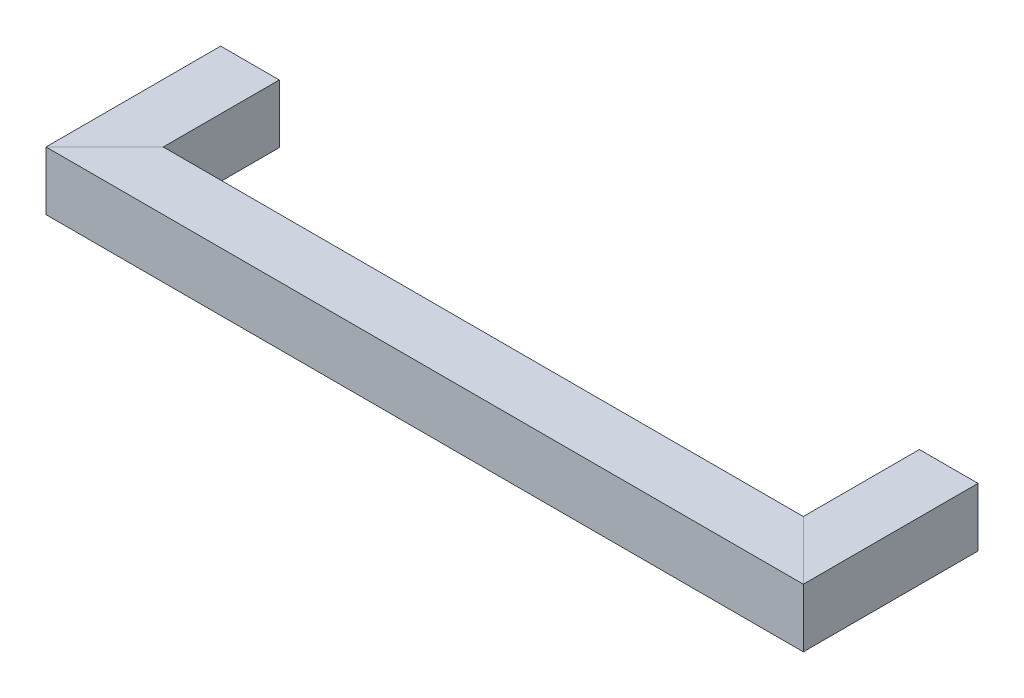
ISO-10303-21;
HEADER;
FILE_DESCRIPTION(('STEP AP214'),'2;1');
FILE_NAME('part.step','',(''),(''),'','','');
FILE_SCHEMA(('AUTOMOTIVE_DESIGN { 1 0 10303 214 1 1 1 1 }'));
ENDSEC;
DATA;
#1=APPLICATION_CONTEXT('core data for automotive mechanical design processes');
#2=APPLICATION_PROTOCOL_DEFINITION('international standard','automotive_design',2000,#1);
#3=PRODUCT_CONTEXT('',#1,'mechanical');
#4=PRODUCT('Part','Part','',(#3));
#5=PRODUCT_RELATED_PRODUCT_CATEGORY('part','',(#4));
#6=PRODUCT_DEFINITION_FORMATION('','',#4);
#7=PRODUCT_DEFINITION_CONTEXT('part definition',#1,'design');
#8=PRODUCT_DEFINITION('design','',#6,#7);
#9=PRODUCT_DEFINITION_SHAPE('','',#8);
#10=(LENGTH_UNIT() NAMED_UNIT(*) SI_UNIT(.MILLI.,.METRE.));
#11=(NAMED_UNIT(*) PLANE_ANGLE_UNIT() SI_UNIT($,.RADIAN.));
#12=(NAMED_UNIT(*) SI_UNIT($,.STERADIAN.) SOLID_ANGLE_UNIT());
#13=UNCERTAINTY_MEASURE_WITH_UNIT(LENGTH_MEASURE(1.E-05),#10,'distance_accuracy_value','');
#14=(GEOMETRIC_REPRESENTATION_CONTEXT(3) GLOBAL_UNCERTAINTY_ASSIGNED_CONTEXT((#13)) GLOBAL_UNIT_ASSIGNED_CONTEXT((#10,
#11,#12)) REPRESENTATION_CONTEXT('',''));
#15=CARTESIAN_POINT('',(0.,0.,0.));
#16=DIRECTION('',(0.,0.,1.));
#17=DIRECTION('',(1.,0.,0.));
#18=AXIS2_PLACEMENT_3D('',#15,#16,#17);
#19=CARTESIAN_POINT('',(298.,0.,0.));
#20=DIRECTION('',(0.,0.,-1.));
#21=DIRECTION('',(-1.,0.,0.));
#22=AXIS2_PLACEMENT_3D('',#19,#20,#21);
#23=PLANE('',#22);
#24=DIRECTION('',(0.,-1.,0.));
#25=VECTOR('',#24,1.);
#26=CARTESIAN_POINT('',(310.5,-12.5,0.));
#27=LINE('',#26,#25);
#28=CARTESIAN_POINT('',(310.5,12.5,0.));
#29=VERTEX_POINT('',#28);
#30=CARTESIAN_POINT('',(310.5,-12.5,0.));
#31=VERTEX_POINT('',#30);
#32=EDGE_CURVE('E84',#29,#31,#27,.T.);
#33=ORIENTED_EDGE('',*,*,#32,.T.);
#34=DIRECTION('',(-1.,0.,0.));
#35=VECTOR('',#34,1.);
#36=CARTESIAN_POINT('',(285.5,-12.5,0.));
#37=LINE('',#36,#35);
#38=CARTESIAN_POINT('',(285.5,-12.5,0.));
#39=VERTEX_POINT('',#38);
#40=EDGE_CURVE('E82',#31,#39,#37,.T.);
#41=ORIENTED_EDGE('',*,*,#40,.T.);
#42=DIRECTION('',(0.,1.,0.));
#43=VECTOR('',#42,1.);
#44=CARTESIAN_POINT('',(285.5,-12.5,0.));
#45=LINE('',#44,#43);
#46=CARTESIAN_POINT('',(285.5,12.5,0.));
#47=VERTEX_POINT('',#46);
#48=EDGE_CURVE('E79',#39,#47,#45,.T.);
#49=ORIENTED_EDGE('',*,*,#48,.T.);
#50=DIRECTION('',(1.,0.,0.));
#51=VECTOR('',#50,1.);
#52=CARTESIAN_POINT('',(285.5,12.5,0.));
#53=LINE('',#52,#51);
#54=EDGE_CURVE('E98',#47,#29,#53,.T.);
#55=ORIENTED_EDGE('',*,*,#54,.T.);
#56=EDGE_LOOP('',(#33,#41,#49,#55));
#57=FACE_BOUND('',#56,.T.);
#58=ADVANCED_FACE('F33',(#57),#23,.T.);
#59=CARTESIAN_POINT('',(0.,0.,0.));
#60=DIRECTION('',(0.,0.,1.));
#61=DIRECTION('',(1.,0.,0.));
#62=AXIS2_PLACEMENT_3D('',#59,#60,#61);
#63=PLANE('',#62);
#64=DIRECTION('',(0.,-1.,0.));
#65=VECTOR('',#64,1.);
#66=CARTESIAN_POINT('',(-12.5,-12.5,0.));
#67=LINE('',#66,#65);
#68=CARTESIAN_POINT('',(-12.5,12.5,0.));
#69=VERTEX_POINT('',#68);
#70=CARTESIAN_POINT('',(-12.5,-12.5,0.));
#71=VERTEX_POINT('',#70);
#72=EDGE_CURVE('E140',#69,#71,#67,.T.);
#73=ORIENTED_EDGE('',*,*,#72,.F.);
#74=DIRECTION('',(-1.,0.,0.));
#75=VECTOR('',#74,1.);
#76=CARTESIAN_POINT('',(12.5,12.5,0.));
#77=LINE('',#76,#75);
#78=CARTESIAN_POINT('',(12.5,12.5,0.));
#79=VERTEX_POINT('',#78);
#80=EDGE_CURVE('E146',#79,#69,#77,.T.);
#81=ORIENTED_EDGE('',*,*,#80,.F.);
#82=DIRECTION('',(0.,1.,0.));
#83=VECTOR('',#82,1.);
#84=CARTESIAN_POINT('',(12.5,-12.5,0.));
#85=LINE('',#84,#83);
#86=CARTESIAN_POINT('',(12.5,-12.5,0.));
#87=VERTEX_POINT('',#86);
#88=EDGE_CURVE('E130',#87,#79,#85,.T.);
#89=ORIENTED_EDGE('',*,*,#88,.F.);
#90=DIRECTION('',(1.,0.,0.));
#91=VECTOR('',#90,1.);
#92=CARTESIAN_POINT('',(12.5,-12.5,0.));
#93=LINE('',#92,#91);
#94=EDGE_CURVE('E136',#71,#87,#93,.T.);
#95=ORIENTED_EDGE('',*,*,#94,.F.);
#96=EDGE_LOOP('',(#73,#81,#89,#95));
#97=FACE_BOUND('',#96,.T.);
#98=ADVANCED_FACE('F179',(#97),#63,.F.);
#99=CARTESIAN_POINT('',(285.5,-12.5,75.85));
#100=DIRECTION('',(-1.,0.,0.));
#101=DIRECTION('',(0.,0.,1.));
#102=AXIS2_PLACEMENT_3D('',#99,#100,#101);
#103=PLANE('',#102);
#104=DIRECTION('',(0.,-1.,0.));
#105=VECTOR('',#104,1.);
#106=CARTESIAN_POINT('',(285.5,-12.5,49.5));
#107=LINE('',#106,#105);
#108=CARTESIAN_POINT('',(285.5,12.5,49.5));
#109=VERTEX_POINT('',#108);
#110=CARTESIAN_POINT('',(285.5,-12.5,49.5));
#111=VERTEX_POINT('',#110);
#112=EDGE_CURVE('E114',#109,#111,#107,.T.);
#113=ORIENTED_EDGE('',*,*,#112,.F.);
#114=DIRECTION('',(0.,0.,-1.));
#115=VECTOR('',#114,1.);
#116=CARTESIAN_POINT('',(285.5,12.5,75.85));
#117=LINE('',#116,#115);
#118=EDGE_CURVE('E96',#109,#47,#117,.T.);
#119=ORIENTED_EDGE('',*,*,#118,.T.);
#120=ORIENTED_EDGE('',*,*,#48,.F.);
#121=DIRECTION('',(0.,0.,-1.));
#122=VECTOR('',#121,1.);
#123=CARTESIAN_POINT('',(285.5,-12.5,75.85));
#124=LINE('',#123,#122);
#125=EDGE_CURVE('E36',#111,#39,#124,.T.);
#126=ORIENTED_EDGE('',*,*,#125,.F.);
#127=EDGE_LOOP('',(#113,#119,#120,#126));
#128=FACE_BOUND('',#127,.T.);
#129=ADVANCED_FACE('F93',(#128),#103,.T.);
#130=CARTESIAN_POINT('',(285.5,12.5,75.85));
#131=DIRECTION('',(0.,1.,0.));
#132=DIRECTION('',(0.,0.,1.));
#133=AXIS2_PLACEMENT_3D('',#130,#131,#132);
#134=PLANE('',#133);
#135=DIRECTION('',(-0.707106781186548,0.,-0.707106781186548));
#136=VECTOR('',#135,1.);
#137=CARTESIAN_POINT('',(135.825,12.5,-100.175));
#138=LINE('',#137,#136);
#139=CARTESIAN_POINT('',(310.5,12.5,74.5));
#140=VERTEX_POINT('',#139);
#141=EDGE_CURVE('E127',#140,#109,#138,.T.);
#142=ORIENTED_EDGE('',*,*,#141,.F.);
#143=DIRECTION('',(0.,0.,-1.));
#144=VECTOR('',#143,1.);
#145=CARTESIAN_POINT('',(310.5,12.5,75.85));
#146=LINE('',#145,#144);
#147=EDGE_CURVE('E107',#140,#29,#146,.T.);
#148=ORIENTED_EDGE('',*,*,#147,.T.);
#149=ORIENTED_EDGE('',*,*,#54,.F.);
#150=ORIENTED_EDGE('',*,*,#118,.F.);
#151=EDGE_LOOP('',(#142,#148,#149,#150));
#152=FACE_BOUND('',#151,.T.);
#153=ADVANCED_FACE('F199',(#152),#134,.T.);
#154=CARTESIAN_POINT('',(310.5,-12.5,75.85));
#155=DIRECTION('',(1.,0.,0.));
#156=DIRECTION('',(0.,0.,-1.));
#157=AXIS2_PLACEMENT_3D('',#154,#155,#156);
#158=PLANE('',#157);
#159=DIRECTION('',(0.,1.,0.));
#160=VECTOR('',#159,1.);
#161=CARTESIAN_POINT('',(310.5,-12.5,74.5));
#162=LINE('',#161,#160);
#163=CARTESIAN_POINT('',(310.5,-12.5,74.5));
#164=VERTEX_POINT('',#163);
#165=EDGE_CURVE('E124',#164,#140,#162,.T.);
#166=ORIENTED_EDGE('',*,*,#165,.F.);
#167=DIRECTION('',(0.,0.,-1.));
#168=VECTOR('',#167,1.);
#169=CARTESIAN_POINT('',(310.5,-12.5,75.85));
#170=LINE('',#169,#168);
#171=EDGE_CURVE('E97',#164,#31,#170,.T.);
#172=ORIENTED_EDGE('',*,*,#171,.T.);
#173=ORIENTED_EDGE('',*,*,#32,.F.);
#174=ORIENTED_EDGE('',*,*,#147,.F.);
#175=EDGE_LOOP('',(#166,#172,#173,#174));
#176=FACE_BOUND('',#175,.T.);
#177=ADVANCED_FACE('F201',(#176),#158,.T.);
#178=CARTESIAN_POINT('',(285.5,-12.5,75.85));
#179=DIRECTION('',(0.,-1.,0.));
#180=DIRECTION('',(1.,0.,0.));
#181=AXIS2_PLACEMENT_3D('',#178,#179,#180);
#182=PLANE('',#181);
#183=DIRECTION('',(0.707106781186548,0.,0.707106781186548));
#184=VECTOR('',#183,1.);
#185=CARTESIAN_POINT('',(135.825,-12.5,-100.175));
#186=LINE('',#185,#184);
#187=EDGE_CURVE('E102',#111,#164,#186,.T.);
#188=ORIENTED_EDGE('',*,*,#187,.F.);
#189=ORIENTED_EDGE('',*,*,#125,.T.);
#190=ORIENTED_EDGE('',*,*,#40,.F.);
#191=ORIENTED_EDGE('',*,*,#171,.F.);
#192=EDGE_LOOP('',(#188,#189,#190,#191));
#193=FACE_BOUND('',#192,.T.);
#194=ADVANCED_FACE('F100',(#193),#182,.T.);
#195=CARTESIAN_POINT('',(-13.85,-12.5,49.5));
#196=DIRECTION('',(0.,-1.,0.));
#197=DIRECTION('',(0.,0.,-1.));
#198=AXIS2_PLACEMENT_3D('',#195,#196,#197);
#199=PLANE('',#198);
#200=DIRECTION('',(1.,0.,0.));
#201=VECTOR('',#200,1.);
#202=CARTESIAN_POINT('',(-13.85,-12.5,49.5));
#203=LINE('',#202,#201);
#204=CARTESIAN_POINT('',(12.5,-12.5,49.5));
#205=VERTEX_POINT('',#204);
#206=EDGE_CURVE('E116',#205,#111,#203,.T.);
#207=ORIENTED_EDGE('',*,*,#206,.T.);
#208=ORIENTED_EDGE('',*,*,#187,.T.);
#209=DIRECTION('',(1.,0.,0.));
#210=VECTOR('',#209,1.);
#211=CARTESIAN_POINT('',(-13.85,-12.5,74.5));
#212=LINE('',#211,#210);
#213=CARTESIAN_POINT('',(-12.5,-12.5,74.5));
#214=VERTEX_POINT('',#213);
#215=EDGE_CURVE('E103',#214,#164,#212,.T.);
#216=ORIENTED_EDGE('',*,*,#215,.F.);
#217=DIRECTION('',(-0.707106781186547,0.,0.707106781186548));
#218=VECTOR('',#217,1.);
#219=CARTESIAN_POINT('',(37.25,-12.5,24.75));
#220=LINE('',#219,#218);
#221=EDGE_CURVE('E134',#205,#214,#220,.T.);
#222=ORIENTED_EDGE('',*,*,#221,.F.);
#223=EDGE_LOOP('',(#207,#208,#216,#222));
#224=FACE_BOUND('',#223,.T.);
#225=ADVANCED_FACE('F203',(#224),#199,.T.);
#226=CARTESIAN_POINT('',(-13.85,-12.5,74.5));
#227=DIRECTION('',(0.,0.,1.));
#228=DIRECTION('',(1.,0.,0.));
#229=AXIS2_PLACEMENT_3D('',#226,#227,#228);
#230=PLANE('',#229);
#231=ORIENTED_EDGE('',*,*,#215,.T.);
#232=ORIENTED_EDGE('',*,*,#165,.T.);
#233=DIRECTION('',(1.,0.,0.));
#234=VECTOR('',#233,1.);
#235=CARTESIAN_POINT('',(-13.85,12.5,74.5));
#236=LINE('',#235,#234);
#237=CARTESIAN_POINT('',(-12.5,12.5,74.5));
#238=VERTEX_POINT('',#237);
#239=EDGE_CURVE('E105',#238,#140,#236,.T.);
#240=ORIENTED_EDGE('',*,*,#239,.F.);
#241=DIRECTION('',(0.,1.,0.));
#242=VECTOR('',#241,1.);
#243=CARTESIAN_POINT('',(-12.5,-12.5,74.5));
#244=LINE('',#243,#242);
#245=EDGE_CURVE('E42',#214,#238,#244,.T.);
#246=ORIENTED_EDGE('',*,*,#245,.F.);
#247=EDGE_LOOP('',(#231,#232,#240,#246));
#248=FACE_BOUND('',#247,.T.);
#249=ADVANCED_FACE('F202',(#248),#230,.T.);
#250=CARTESIAN_POINT('',(-13.85,12.5,49.5));
#251=DIRECTION('',(0.,1.,0.));
#252=DIRECTION('',(0.,0.,1.));
#253=AXIS2_PLACEMENT_3D('',#250,#251,#252);
#254=PLANE('',#253);
#255=ORIENTED_EDGE('',*,*,#239,.T.);
#256=ORIENTED_EDGE('',*,*,#141,.T.);
#257=DIRECTION('',(1.,0.,0.));
#258=VECTOR('',#257,1.);
#259=CARTESIAN_POINT('',(-13.85,12.5,49.5));
#260=LINE('',#259,#258);
#261=CARTESIAN_POINT('',(12.5,12.5,49.5));
#262=VERTEX_POINT('',#261);
#263=EDGE_CURVE('E119',#262,#109,#260,.T.);
#264=ORIENTED_EDGE('',*,*,#263,.F.);
#265=DIRECTION('',(0.707106781186547,0.,-0.707106781186548));
#266=VECTOR('',#265,1.);
#267=CARTESIAN_POINT('',(37.25,12.5,24.75));
#268=LINE('',#267,#266);
#269=EDGE_CURVE('E11',#238,#262,#268,.T.);
#270=ORIENTED_EDGE('',*,*,#269,.F.);
#271=EDGE_LOOP('',(#255,#256,#264,#270));
#272=FACE_BOUND('',#271,.T.);
#273=ADVANCED_FACE('F196',(#272),#254,.T.);
#274=CARTESIAN_POINT('',(-13.85,-12.5,49.5));
#275=DIRECTION('',(0.,0.,-1.));
#276=DIRECTION('',(-1.,0.,0.));
#277=AXIS2_PLACEMENT_3D('',#274,#275,#276);
#278=PLANE('',#277);
#279=ORIENTED_EDGE('',*,*,#263,.T.);
#280=ORIENTED_EDGE('',*,*,#112,.T.);
#281=ORIENTED_EDGE('',*,*,#206,.F.);
#282=DIRECTION('',(0.,-1.,0.));
#283=VECTOR('',#282,1.);
#284=CARTESIAN_POINT('',(12.5,-12.5,49.5));
#285=LINE('',#284,#283);
#286=EDGE_CURVE('E131',#262,#205,#285,.T.);
#287=ORIENTED_EDGE('',*,*,#286,.F.);
#288=EDGE_LOOP('',(#279,#280,#281,#287));
#289=FACE_BOUND('',#288,.T.);
#290=ADVANCED_FACE('F195',(#289),#278,.T.);
#291=CARTESIAN_POINT('',(12.5,-12.5,0.));
#292=DIRECTION('',(0.,-1.,0.));
#293=DIRECTION('',(1.,0.,0.));
#294=AXIS2_PLACEMENT_3D('',#291,#292,#293);
#295=PLANE('',#294);
#296=DIRECTION('',(0.,0.,1.));
#297=VECTOR('',#296,1.);
#298=CARTESIAN_POINT('',(12.5,-12.5,0.));
#299=LINE('',#298,#297);
#300=EDGE_CURVE('E139',#87,#205,#299,.T.);
#301=ORIENTED_EDGE('',*,*,#300,.T.);
#302=ORIENTED_EDGE('',*,*,#221,.T.);
#303=DIRECTION('',(0.,0.,1.));
#304=VECTOR('',#303,1.);
#305=CARTESIAN_POINT('',(-12.5,-12.5,0.));
#306=LINE('',#305,#304);
#307=EDGE_CURVE('E135',#71,#214,#306,.T.);
#308=ORIENTED_EDGE('',*,*,#307,.F.);
#309=ORIENTED_EDGE('',*,*,#94,.T.);
#310=EDGE_LOOP('',(#301,#302,#308,#309));
#311=FACE_BOUND('',#310,.T.);
#312=ADVANCED_FACE('F188',(#311),#295,.T.);
#313=CARTESIAN_POINT('',(-12.5,-12.5,0.));
#314=DIRECTION('',(-1.,0.,0.));
#315=DIRECTION('',(0.,0.,1.));
#316=AXIS2_PLACEMENT_3D('',#313,#314,#315);
#317=PLANE('',#316);
#318=ORIENTED_EDGE('',*,*,#307,.T.);
#319=ORIENTED_EDGE('',*,*,#245,.T.);
#320=DIRECTION('',(0.,0.,1.));
#321=VECTOR('',#320,1.);
#322=CARTESIAN_POINT('',(-12.5,12.5,0.));
#323=LINE('',#322,#321);
#324=EDGE_CURVE('E143',#69,#238,#323,.T.);
#325=ORIENTED_EDGE('',*,*,#324,.F.);
#326=ORIENTED_EDGE('',*,*,#72,.T.);
#327=EDGE_LOOP('',(#318,#319,#325,#326));
#328=FACE_BOUND('',#327,.T.);
#329=ADVANCED_FACE('F163',(#328),#317,.T.);
#330=CARTESIAN_POINT('',(12.5,12.5,0.));
#331=DIRECTION('',(0.,1.,0.));
#332=DIRECTION('',(0.,0.,1.));
#333=AXIS2_PLACEMENT_3D('',#330,#331,#332);
#334=PLANE('',#333);
#335=ORIENTED_EDGE('',*,*,#324,.T.);
#336=ORIENTED_EDGE('',*,*,#269,.T.);
#337=DIRECTION('',(0.,0.,1.));
#338=VECTOR('',#337,1.);
#339=CARTESIAN_POINT('',(12.5,12.5,0.));
#340=LINE('',#339,#338);
#341=EDGE_CURVE('E149',#79,#262,#340,.T.);
#342=ORIENTED_EDGE('',*,*,#341,.F.);
#343=ORIENTED_EDGE('',*,*,#80,.T.);
#344=EDGE_LOOP('',(#335,#336,#342,#343));
#345=FACE_BOUND('',#344,.T.);
#346=ADVANCED_FACE('F169',(#345),#334,.T.);
#347=CARTESIAN_POINT('',(12.5,-12.5,0.));
#348=DIRECTION('',(1.,0.,0.));
#349=DIRECTION('',(0.,0.,-1.));
#350=AXIS2_PLACEMENT_3D('',#347,#348,#349);
#351=PLANE('',#350);
#352=ORIENTED_EDGE('',*,*,#341,.T.);
#353=ORIENTED_EDGE('',*,*,#286,.T.);
#354=ORIENTED_EDGE('',*,*,#300,.F.);
#355=ORIENTED_EDGE('',*,*,#88,.T.);
#356=EDGE_LOOP('',(#352,#353,#354,#355));
#357=FACE_BOUND('',#356,.T.);
#358=ADVANCED_FACE('F184',(#357),#351,.T.);
#359=CLOSED_SHELL('',(#58,#98,#129,#153,#177,#194,#225,#249,#273,#290,#312,#329,#346,#358));
#360=MANIFOLD_SOLID_BREP('B2',#359);
#361=ADVANCED_BREP_SHAPE_REPRESENTATION('',(#18,#360),#14);
#362=SHAPE_DEFINITION_REPRESENTATION(#9,#361);
ENDSEC;
END-ISO-10303-21;
